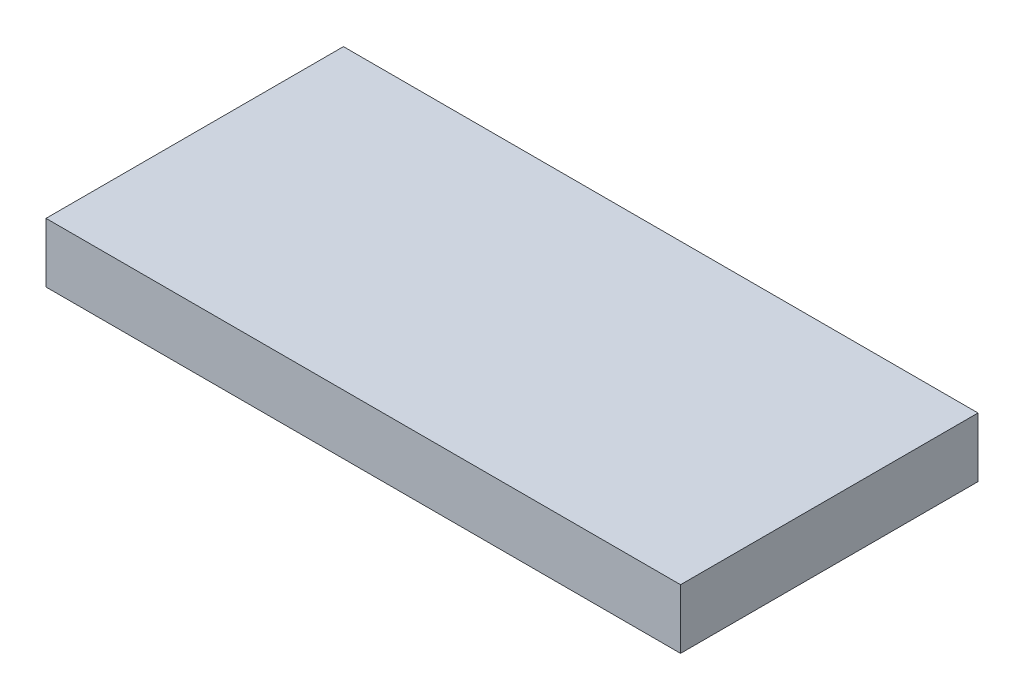
ISO-10303-21;
HEADER;
FILE_DESCRIPTION(('STEP AP214'),'2;1');
FILE_NAME('part.step','',(''),(''),'','','');
FILE_SCHEMA(('AUTOMOTIVE_DESIGN { 1 0 10303 214 1 1 1 1 }'));
ENDSEC;
DATA;
#1=APPLICATION_CONTEXT('core data for automotive mechanical design processes');
#2=APPLICATION_PROTOCOL_DEFINITION('international standard','automotive_design',2000,#1);
#3=PRODUCT_CONTEXT('',#1,'mechanical');
#4=PRODUCT('Part','Part','',(#3));
#5=PRODUCT_RELATED_PRODUCT_CATEGORY('part','',(#4));
#6=PRODUCT_DEFINITION_FORMATION('','',#4);
#7=PRODUCT_DEFINITION_CONTEXT('part definition',#1,'design');
#8=PRODUCT_DEFINITION('design','',#6,#7);
#9=PRODUCT_DEFINITION_SHAPE('','',#8);
#10=(LENGTH_UNIT() NAMED_UNIT(*) SI_UNIT(.MILLI.,.METRE.));
#11=(NAMED_UNIT(*) PLANE_ANGLE_UNIT() SI_UNIT($,.RADIAN.));
#12=(NAMED_UNIT(*) SI_UNIT($,.STERADIAN.) SOLID_ANGLE_UNIT());
#13=UNCERTAINTY_MEASURE_WITH_UNIT(LENGTH_MEASURE(1.E-05),#10,'distance_accuracy_value','');
#14=(GEOMETRIC_REPRESENTATION_CONTEXT(3) GLOBAL_UNCERTAINTY_ASSIGNED_CONTEXT((#13)) GLOBAL_UNIT_ASSIGNED_CONTEXT((#10,
#11,#12)) REPRESENTATION_CONTEXT('',''));
#15=CARTESIAN_POINT('',(0.,0.,0.));
#16=DIRECTION('',(0.,0.,1.));
#17=DIRECTION('',(1.,0.,0.));
#18=AXIS2_PLACEMENT_3D('',#15,#16,#17);
#19=CARTESIAN_POINT('',(45.000000521541,-1.665334556239E-11,0.));
#20=DIRECTION('',(1.,-3.700743415417E-13,0.));
#21=DIRECTION('',(-3.700743415417E-13,-1.,0.));
#22=AXIS2_PLACEMENT_3D('',#19,#20,#21);
#23=PLANE('',#22);
#24=DIRECTION('',(-3.700743415417E-13,-1.,0.));
#25=VECTOR('',#24,1.);
#26=CARTESIAN_POINT('',(45.000000521541,1.7,35.199999107048));
#27=LINE('',#26,#25);
#28=CARTESIAN_POINT('',(45.000000521541,1.7,35.199999107048));
#29=VERTEX_POINT('',#28);
#30=CARTESIAN_POINT('',(45.000000521541,1.55,35.199999107048));
#31=VERTEX_POINT('',#30);
#32=EDGE_CURVE('E79',#29,#31,#27,.T.);
#33=ORIENTED_EDGE('',*,*,#32,.F.);
#34=DIRECTION('',(0.,0.,1.));
#35=VECTOR('',#34,1.);
#36=CARTESIAN_POINT('',(45.000000521541,1.7,35.199999107048));
#37=LINE('',#36,#35);
#38=CARTESIAN_POINT('',(45.000000521541,1.7,34.449999123812));
#39=VERTEX_POINT('',#38);
#40=EDGE_CURVE('E27',#39,#29,#37,.T.);
#41=ORIENTED_EDGE('',*,*,#40,.F.);
#42=DIRECTION('',(3.700743415417E-13,1.,0.));
#43=VECTOR('',#42,1.);
#44=CARTESIAN_POINT('',(45.000000521541,1.7,34.449999123812));
#45=LINE('',#44,#43);
#46=CARTESIAN_POINT('',(45.000000521541,1.55,34.449999123812));
#47=VERTEX_POINT('',#46);
#48=EDGE_CURVE('E97',#47,#39,#45,.T.);
#49=ORIENTED_EDGE('',*,*,#48,.F.);
#50=DIRECTION('',(0.,0.,-1.));
#51=VECTOR('',#50,1.);
#52=CARTESIAN_POINT('',(45.000000521541,1.55,35.199999107048));
#53=LINE('',#52,#51);
#54=EDGE_CURVE('E83',#31,#47,#53,.T.);
#55=ORIENTED_EDGE('',*,*,#54,.F.);
#56=EDGE_LOOP('',(#33,#41,#49,#55));
#57=FACE_BOUND('',#56,.T.);
#58=ADVANCED_FACE('F17',(#57),#23,.F.);
#59=CARTESIAN_POINT('',(46.600000521541,-1.722128750778E-11,0.));
#60=DIRECTION('',(1.,-3.700743415417E-13,0.));
#61=DIRECTION('',(-3.700743415417E-13,-1.,0.));
#62=AXIS2_PLACEMENT_3D('',#59,#60,#61);
#63=PLANE('',#62);
#64=DIRECTION('',(-3.700743415417E-13,-1.,0.));
#65=VECTOR('',#64,1.);
#66=CARTESIAN_POINT('',(46.600000521541,1.699999999999,35.199999107048));
#67=LINE('',#66,#65);
#68=CARTESIAN_POINT('',(46.600000521541,1.699999999999,35.199999107048));
#69=VERTEX_POINT('',#68);
#70=CARTESIAN_POINT('',(46.600000521541,1.549999999999,35.199999107048));
#71=VERTEX_POINT('',#70);
#72=EDGE_CURVE('E81',#69,#71,#67,.T.);
#73=ORIENTED_EDGE('',*,*,#72,.T.);
#74=DIRECTION('',(0.,0.,-1.));
#75=VECTOR('',#74,1.);
#76=CARTESIAN_POINT('',(46.600000521541,1.549999999999,35.199999107048));
#77=LINE('',#76,#75);
#78=CARTESIAN_POINT('',(46.600000521541,1.549999999999,34.449999123812));
#79=VERTEX_POINT('',#78);
#80=EDGE_CURVE('E93',#71,#79,#77,.T.);
#81=ORIENTED_EDGE('',*,*,#80,.T.);
#82=DIRECTION('',(3.700743415417E-13,1.,0.));
#83=VECTOR('',#82,1.);
#84=CARTESIAN_POINT('',(46.600000521541,1.699999999999,34.449999123812));
#85=LINE('',#84,#83);
#86=CARTESIAN_POINT('',(46.600000521541,1.699999999999,34.449999123812));
#87=VERTEX_POINT('',#86);
#88=EDGE_CURVE('E20',#79,#87,#85,.T.);
#89=ORIENTED_EDGE('',*,*,#88,.T.);
#90=DIRECTION('',(0.,0.,1.));
#91=VECTOR('',#90,1.);
#92=CARTESIAN_POINT('',(46.600000521541,1.699999999999,35.199999107048));
#93=LINE('',#92,#91);
#94=EDGE_CURVE('E11',#87,#69,#93,.T.);
#95=ORIENTED_EDGE('',*,*,#94,.T.);
#96=EDGE_LOOP('',(#73,#81,#89,#95));
#97=FACE_BOUND('',#96,.T.);
#98=ADVANCED_FACE('F116',(#97),#63,.T.);
#99=CARTESIAN_POINT('',(46.600000521541,1.699999999999,35.199999107048));
#100=DIRECTION('',(-3.54963715872E-13,-1.,0.));
#101=DIRECTION('',(-1.,3.54963715872E-13,0.));
#102=AXIS2_PLACEMENT_3D('',#99,#100,#101);
#103=PLANE('',#102);
#104=ORIENTED_EDGE('',*,*,#40,.T.);
#105=DIRECTION('',(-1.,3.54963715872E-13,0.));
#106=VECTOR('',#105,1.);
#107=CARTESIAN_POINT('',(46.600000521541,1.699999999999,35.199999107048));
#108=LINE('',#107,#106);
#109=EDGE_CURVE('E65',#69,#29,#108,.T.);
#110=ORIENTED_EDGE('',*,*,#109,.F.);
#111=ORIENTED_EDGE('',*,*,#94,.F.);
#112=DIRECTION('',(-1.,3.54963715872E-13,0.));
#113=VECTOR('',#112,1.);
#114=CARTESIAN_POINT('',(46.600000521541,1.699999999999,34.449999123812));
#115=LINE('',#114,#113);
#116=EDGE_CURVE('E68',#87,#39,#115,.T.);
#117=ORIENTED_EDGE('',*,*,#116,.T.);
#118=EDGE_LOOP('',(#104,#110,#111,#117));
#119=FACE_BOUND('',#118,.T.);
#120=ADVANCED_FACE('F64',(#119),#103,.F.);
#121=CARTESIAN_POINT('',(46.600000521541,1.699999999999,34.449999123812));
#122=DIRECTION('',(0.,0.,1.));
#123=DIRECTION('',(1.,0.,0.));
#124=AXIS2_PLACEMENT_3D('',#121,#122,#123);
#125=PLANE('',#124);
#126=ORIENTED_EDGE('',*,*,#48,.T.);
#127=ORIENTED_EDGE('',*,*,#116,.F.);
#128=ORIENTED_EDGE('',*,*,#88,.F.);
#129=DIRECTION('',(-1.,3.54963715872E-13,0.));
#130=VECTOR('',#129,1.);
#131=CARTESIAN_POINT('',(46.600000521541,1.549999999999,34.449999123812));
#132=LINE('',#131,#130);
#133=EDGE_CURVE('E98',#79,#47,#132,.T.);
#134=ORIENTED_EDGE('',*,*,#133,.T.);
#135=EDGE_LOOP('',(#126,#127,#128,#134));
#136=FACE_BOUND('',#135,.T.);
#137=ADVANCED_FACE('F112',(#136),#125,.F.);
#138=CARTESIAN_POINT('',(46.600000521541,1.549999999999,35.199999107048));
#139=DIRECTION('',(3.54963715872E-13,1.,0.));
#140=DIRECTION('',(1.,-3.54963715872E-13,0.));
#141=AXIS2_PLACEMENT_3D('',#138,#139,#140);
#142=PLANE('',#141);
#143=ORIENTED_EDGE('',*,*,#54,.T.);
#144=ORIENTED_EDGE('',*,*,#133,.F.);
#145=ORIENTED_EDGE('',*,*,#80,.F.);
#146=DIRECTION('',(-1.,3.54963715872E-13,0.));
#147=VECTOR('',#146,1.);
#148=CARTESIAN_POINT('',(46.600000521541,1.549999999999,35.199999107048));
#149=LINE('',#148,#147);
#150=EDGE_CURVE('E88',#71,#31,#149,.T.);
#151=ORIENTED_EDGE('',*,*,#150,.T.);
#152=EDGE_LOOP('',(#143,#144,#145,#151));
#153=FACE_BOUND('',#152,.T.);
#154=ADVANCED_FACE('F114',(#153),#142,.F.);
#155=CARTESIAN_POINT('',(46.600000521541,1.699999999999,35.199999107048));
#156=DIRECTION('',(0.,0.,-1.));
#157=DIRECTION('',(0.,-1.,0.));
#158=AXIS2_PLACEMENT_3D('',#155,#156,#157);
#159=PLANE('',#158);
#160=ORIENTED_EDGE('',*,*,#32,.T.);
#161=ORIENTED_EDGE('',*,*,#150,.F.);
#162=ORIENTED_EDGE('',*,*,#72,.F.);
#163=ORIENTED_EDGE('',*,*,#109,.T.);
#164=EDGE_LOOP('',(#160,#161,#162,#163));
#165=FACE_BOUND('',#164,.T.);
#166=ADVANCED_FACE('F77',(#165),#159,.F.);
#167=CLOSED_SHELL('',(#58,#98,#120,#137,#154,#166));
#168=MANIFOLD_SOLID_BREP('B1',#167);
#169=ADVANCED_BREP_SHAPE_REPRESENTATION('',(#18,#168),#14);
#170=SHAPE_DEFINITION_REPRESENTATION(#9,#169);
ENDSEC;
END-ISO-10303-21;
